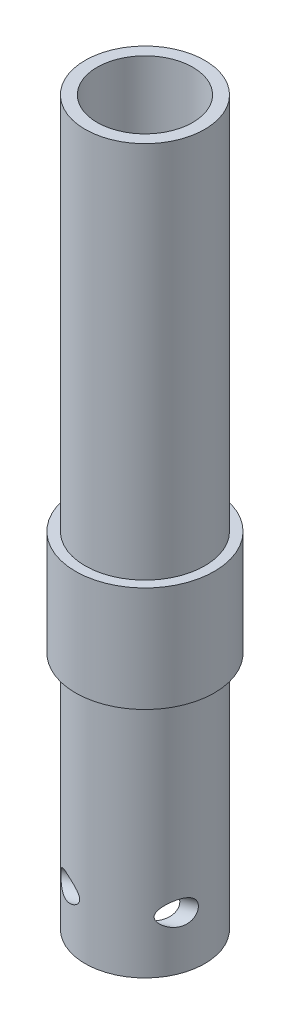
ISO-10303-21;
HEADER;
FILE_DESCRIPTION(('STEP AP214'),'2;1');
FILE_NAME('part.step','',(''),(''),'','','');
FILE_SCHEMA(('AUTOMOTIVE_DESIGN { 1 0 10303 214 1 1 1 1 }'));
ENDSEC;
DATA;
#1=APPLICATION_CONTEXT('core data for automotive mechanical design processes');
#2=APPLICATION_PROTOCOL_DEFINITION('international standard','automotive_design',2000,#1);
#3=PRODUCT_CONTEXT('',#1,'mechanical');
#4=PRODUCT('Part','Part','',(#3));
#5=PRODUCT_RELATED_PRODUCT_CATEGORY('part','',(#4));
#6=PRODUCT_DEFINITION_FORMATION('','',#4);
#7=PRODUCT_DEFINITION_CONTEXT('part definition',#1,'design');
#8=PRODUCT_DEFINITION('design','',#6,#7);
#9=PRODUCT_DEFINITION_SHAPE('','',#8);
#10=(LENGTH_UNIT() NAMED_UNIT(*) SI_UNIT(.MILLI.,.METRE.));
#11=(NAMED_UNIT(*) PLANE_ANGLE_UNIT() SI_UNIT($,.RADIAN.));
#12=(NAMED_UNIT(*) SI_UNIT($,.STERADIAN.) SOLID_ANGLE_UNIT());
#13=UNCERTAINTY_MEASURE_WITH_UNIT(LENGTH_MEASURE(1.E-05),#10,'distance_accuracy_value','');
#14=(GEOMETRIC_REPRESENTATION_CONTEXT(3) GLOBAL_UNCERTAINTY_ASSIGNED_CONTEXT((#13)) GLOBAL_UNIT_ASSIGNED_CONTEXT((#10,
#11,#12)) REPRESENTATION_CONTEXT('',''));
#15=CARTESIAN_POINT('',(0.,0.,0.));
#16=DIRECTION('',(0.,0.,1.));
#17=DIRECTION('',(1.,0.,0.));
#18=AXIS2_PLACEMENT_3D('',#15,#16,#17);
#19=CARTESIAN_POINT('',(0.,100.,0.));
#20=DIRECTION('',(0.,-1.,0.));
#21=DIRECTION('',(0.,0.,-1.));
#22=AXIS2_PLACEMENT_3D('',#19,#20,#21);
#23=CYLINDRICAL_SURFACE('',#22,12.5);
#24=CARTESIAN_POINT('',(-7.776099971489,45.,9.78684163729079));
#25=CARTESIAN_POINT('',(-7.77609778483126,45.1263367003507,9.78684471094488));
#26=CARTESIAN_POINT('',(-7.76752804540182,45.2527129329751,9.79367117736765));
#27=CARTESIAN_POINT('',(-7.73348745912618,45.5017566723523,9.82057156383112));
#28=CARTESIAN_POINT('',(-7.70800759392511,45.6244221636082,9.84065255262231));
#29=CARTESIAN_POINT('',(-7.64095105723785,45.8623118534212,9.89280807624151));
#30=CARTESIAN_POINT('',(-7.59940421681152,45.9775493833398,9.92486038054539));
#31=CARTESIAN_POINT('',(-7.50141378383988,46.1979201252928,9.99912756693056));
#32=CARTESIAN_POINT('',(-7.44497031270984,46.3030534196724,10.041342366182));
#33=CARTESIAN_POINT('',(-7.31674408794348,46.5042045491976,10.1351735030327));
#34=CARTESIAN_POINT('',(-7.24453182535561,46.5998278128818,10.1870454328291));
#35=CARTESIAN_POINT('',(-7.08790573048695,46.7765673728666,10.2966367002103));
#36=CARTESIAN_POINT('',(-7.0034887522786,46.8576799167386,10.3543575442794));
#37=CARTESIAN_POINT('',(-6.81510404323921,47.0125490646044,10.4794278272812));
#38=CARTESIAN_POINT('',(-6.71001370895046,47.0846326370942,10.5471512396708));
#39=CARTESIAN_POINT('',(-6.49019510251226,47.2105647081269,10.6838281870947));
#40=CARTESIAN_POINT('',(-6.37546017947159,47.2644004921285,10.7527825447454));
#41=CARTESIAN_POINT('',(-6.08637606215792,47.3747285651149,10.9199232980082));
#42=CARTESIAN_POINT('',(-5.90811068690859,47.4218578516402,11.017545209286));
#43=CARTESIAN_POINT('',(-5.54252950789474,47.4840110646395,11.2059297606435));
#44=CARTESIAN_POINT('',(-5.35519830625816,47.4989782580308,11.2966800077852));
#45=CARTESIAN_POINT('',(-5.04250259514496,47.5005813506547,11.438600782103));
#46=CARTESIAN_POINT('',(-4.91832843089079,47.495281746637,11.4925313012609));
#47=CARTESIAN_POINT('',(-4.66905514299733,47.4738190684344,11.5960389488433));
#48=CARTESIAN_POINT('',(-4.54395573478964,47.4576525018205,11.6456146719284));
#49=CARTESIAN_POINT('',(-4.29348840302836,47.4152547159133,11.7402695586507));
#50=CARTESIAN_POINT('',(-4.16812045260854,47.3890030199709,11.7853393373357));
#51=CARTESIAN_POINT('',(-3.91814072772144,47.3270910950891,11.8707884126639));
#52=CARTESIAN_POINT('',(-3.79352885737249,47.291432085767,11.9111683163522));
#53=CARTESIAN_POINT('',(-3.54341036382618,47.2103612713136,11.9879808111495));
#54=CARTESIAN_POINT('',(-3.41793235649242,47.1647756638201,12.0243229287864));
#55=CARTESIAN_POINT('',(-3.16931903756685,47.0644385485629,12.092229873619));
#56=CARTESIAN_POINT('',(-3.04618445762858,47.0096842288237,12.1237932295319));
#57=CARTESIAN_POINT('',(-2.80375658809936,46.8910806519565,12.1821358820797));
#58=CARTESIAN_POINT('',(-2.68445124860519,46.8272642604897,12.2089317107726));
#59=CARTESIAN_POINT('',(-2.45069474262067,46.6898797267467,12.2579903614303));
#60=CARTESIAN_POINT('',(-2.33623978339454,46.6163193966111,12.2802567789339));
#61=CARTESIAN_POINT('',(-2.12843005287223,46.4684237313358,12.3178514991161));
#62=CARTESIAN_POINT('',(-2.0342489467965,46.3953910364904,12.3337029553571));
#63=CARTESIAN_POINT('',(-1.85321320282143,46.2397101546404,12.3622003087538));
#64=CARTESIAN_POINT('',(-1.76637257199522,46.1570442697515,12.3748401657623));
#65=CARTESIAN_POINT('',(-1.60280561954686,45.9794472991353,12.3970923177274));
#66=CARTESIAN_POINT('',(-1.5262412827473,45.8843580460695,12.4066588435492));
#67=CARTESIAN_POINT('',(-1.39171033185998,45.6815944637039,12.4224683731489));
#68=CARTESIAN_POINT('',(-1.33364854276962,45.573988557738,12.4287284978488));
#69=CARTESIAN_POINT('',(-1.26438063053181,45.3952681727856,12.4359162812486));
#70=CARTESIAN_POINT('',(-1.24373983894188,45.3278798124946,12.4379793758663));
#71=CARTESIAN_POINT('',(-1.21389505768716,45.1905922472851,12.4409279695585));
#72=CARTESIAN_POINT('',(-1.20467731688646,45.1206961657279,12.4418148846153));
#73=CARTESIAN_POINT('',(-1.19872668606382,44.980134474972,12.4423899293371));
#74=CARTESIAN_POINT('',(-1.20203290619007,44.9094671434466,12.4420743036591));
#75=CARTESIAN_POINT('',(-1.22080566699826,44.7697748035186,12.4402457898281));
#76=CARTESIAN_POINT('',(-1.23628363619472,44.7007514014487,12.4387317764551));
#77=CARTESIAN_POINT('',(-1.28302037743132,44.5489711414792,12.4340069084293));
#78=CARTESIAN_POINT('',(-1.31728271913174,44.467162524843,12.4304634578037));
#79=CARTESIAN_POINT('',(-1.39826831832508,44.3100926437208,12.4216145755233));
#80=CARTESIAN_POINT('',(-1.44501952990453,44.2348465757813,12.4163051845129));
#81=CARTESIAN_POINT('',(-1.58006736815426,44.0450216495398,12.4000172433748));
#82=CARTESIAN_POINT('',(-1.67584717511204,43.9359549933466,12.3875824981354));
#83=CARTESIAN_POINT('',(-1.88146170230792,43.7327860507166,12.35803437011));
#84=CARTESIAN_POINT('',(-1.99133728940761,43.638729134213,12.3409072121662));
#85=CARTESIAN_POINT('',(-2.20723686998258,43.4730907920396,12.3040138501714));
#86=CARTESIAN_POINT('',(-2.31233598505724,43.4001735691256,12.2847511736937));
#87=CARTESIAN_POINT('',(-2.52750254624231,43.2632643504847,12.2422943680612));
#88=CARTESIAN_POINT('',(-2.63757351313665,43.1992788151016,12.219097419811));
#89=CARTESIAN_POINT('',(-2.86136153217914,43.0795677051564,12.1686395272227));
#90=CARTESIAN_POINT('',(-2.97508248251076,43.0238513450123,12.1413741161783));
#91=CARTESIAN_POINT('',(-3.20504951425737,42.9204892989775,12.0827041635367));
#92=CARTESIAN_POINT('',(-3.32129495786626,42.8728416007203,12.0513006574864));
#93=CARTESIAN_POINT('',(-3.56197248745999,42.7832127017265,11.9824396519709));
#94=CARTESIAN_POINT('',(-3.68650515755533,42.7416826000439,11.9447453047888));
#95=CARTESIAN_POINT('',(-3.93679817157988,42.6678454567598,11.8646067727875));
#96=CARTESIAN_POINT('',(-4.0625587079785,42.6355398859214,11.8221618320317));
#97=CARTESIAN_POINT('',(-4.31435317409858,42.5807264585529,11.7326115142855));
#98=CARTESIAN_POINT('',(-4.44038639594581,42.5582037581264,11.6855133320664));
#99=CARTESIAN_POINT('',(-4.6920952346984,42.5236282588308,11.586740088459));
#100=CARTESIAN_POINT('',(-4.81777082795195,42.5115761370997,11.5350647313002));
#101=CARTESIAN_POINT('',(-5.13778800811408,42.4953136443921,11.3972821522583));
#102=CARTESIAN_POINT('',(-5.33130407444943,42.4992346270142,11.3080551360534));
#103=CARTESIAN_POINT('',(-5.71085787813164,42.5390327405406,11.1211815819326));
#104=CARTESIAN_POINT('',(-5.89690427469158,42.5748716830064,11.0235452314787));
#105=CARTESIAN_POINT('',(-6.21960000741112,42.6720115964009,10.8440560463948));
#106=CARTESIAN_POINT('',(-6.35865021034996,42.7267287953602,10.7629859266446));
#107=CARTESIAN_POINT('',(-6.62450163098483,42.8611730072892,10.6014183118697));
#108=CARTESIAN_POINT('',(-6.75131645630706,42.9408718075902,10.5209202751321));
#109=CARTESIAN_POINT('',(-6.97023971097941,43.1117351403136,10.3769107056829));
#110=CARTESIAN_POINT('',(-7.06469034269178,43.1992861827513,10.3126832458939));
#111=CARTESIAN_POINT('',(-7.23893918287557,43.3921279007947,10.1911257270115));
#112=CARTESIAN_POINT('',(-7.31873903330125,43.4974165859537,10.1337948952422));
#113=CARTESIAN_POINT('',(-7.46138358901852,43.7243910629884,10.0292399930697));
#114=CARTESIAN_POINT('',(-7.52413349599876,43.8461631110204,9.98207272094039));
#115=CARTESIAN_POINT('',(-7.62975462007967,44.1022198715874,9.90158073751425));
#116=CARTESIAN_POINT('',(-7.67264734251533,44.2364908575211,9.86824105502995));
#117=CARTESIAN_POINT('',(-7.72843411029583,44.4760344912442,9.82457042199352));
#118=CARTESIAN_POINT('',(-7.74627477476798,44.5795090308142,9.81047674474926));
#119=CARTESIAN_POINT('',(-7.77010752498611,44.7886467633404,9.79161192830079));
#120=CARTESIAN_POINT('',(-7.77610180079786,44.894309548101,9.78683906594067));
#121=CARTESIAN_POINT('',(-7.776099971489,45.,9.78684163729079));
#122=B_SPLINE_CURVE_WITH_KNOTS('',3,(#24,#25,#26,#27,#28,#29,#30,#31,#32,#33,#34,#35,#36,#37,
#38,#39,#40,#41,#42,#43,#44,#45,#46,#47,#48,#49,#50,#51,#52,#53,#54,#55,#56,#57,#58,#59,#60,#61,
#62,#63,#64,#65,#66,#67,#68,#69,#70,#71,#72,#73,#74,#75,#76,#77,#78,#79,#80,#81,#82,#83,#84,#85,
#86,#87,#88,#89,#90,#91,#92,#93,#94,#95,#96,#97,#98,#99,#100,#101,#102,#103,#104,#105,#106,#107,
#108,#109,#110,#111,#112,#113,#114,#115,#116,#117,#118,#119,#120,#121),.UNSPECIFIED.,.T.,.F.,(4,
2,2,2,2,2,2,2,2,2,2,2,2,2,2,2,2,2,2,2,2,2,2,2,2,2,2,2,2,2,2,2,2,2,2,2,2,2,2,2,2,2,2,2,2,2,2,2,
4),(0.,0.378611784771891,0.757425649778078,1.13553953354858,1.51365033559022,1.90374638766344,
2.29394317204444,2.72521279259838,3.15678229482531,3.7792937001018,4.40290230068789,
4.80887518845114,5.21497861037193,5.62191097213871,6.02879060279984,6.44346747439869,
6.85827175800607,7.27160835956224,7.68461555455889,8.04479518496477,8.40564728345281,
8.77164788229967,9.13573423283271,9.34642705536553,9.55686599747781,9.7679626447134,
9.97925773555581,10.2440571781761,10.5094543663871,10.944072187441,11.3799798125721,
11.7675308137965,12.1553606963811,12.5436195479885,12.9317814227355,13.3411248953226,
13.7505335974062,14.1593189004075,14.5681306378061,15.2051180699423,15.8413443969102,
16.3494025045992,16.8568888978028,17.2868210105547,17.7167049101534,18.1489322200028,
18.5806903261781,18.8974870317294,19.2142251649543),.UNSPECIFIED.);
#123=CARTESIAN_POINT('',(-7.776099971489,45.,9.78684163729079));
#124=VERTEX_POINT('',#123);
#125=EDGE_CURVE('E87',#124,#124,#122,.T.);
#126=ORIENTED_EDGE('',*,*,#125,.T.);
#127=EDGE_LOOP('',(#126));
#128=FACE_BOUND('',#127,.T.);
#129=CARTESIAN_POINT('',(12.4351333592483,45.,1.27179335495583));
#130=CARTESIAN_POINT('',(12.4351340313042,44.8736632996493,1.27179706671584));
#131=CARTESIAN_POINT('',(12.4340328584509,44.7472870670249,1.2826979151258));
#132=CARTESIAN_POINT('',(12.4295045168785,44.4982433276476,1.32584749714552));
#133=CARTESIAN_POINT('',(12.4260761069961,44.3755778363918,1.35810762186901));
#134=CARTESIAN_POINT('',(12.4165578264944,44.1376881465788,1.44252432692656));
#135=CARTESIAN_POINT('',(12.4104728854913,44.0224506166602,1.49464403196783));
#136=CARTESIAN_POINT('',(12.3951695797011,43.8020798747072,1.61664218260722));
#137=CARTESIAN_POINT('',(12.3859512404527,43.6969465803276,1.68652048346341));
#138=CARTESIAN_POINT('',(12.3635274291012,43.4957954508023,1.84382089555759));
#139=CARTESIAN_POINT('',(12.3502048360645,43.4001721871182,1.93172889566931));
#140=CARTESIAN_POINT('',(12.3192209671665,43.2234326271333,2.12036075763363));
#141=CARTESIAN_POINT('',(12.3015585718399,43.1423200832614,2.22108792299237));
#142=CARTESIAN_POINT('',(12.2594673336961,42.9874509353956,2.4432583574825));
#143=CARTESIAN_POINT('',(12.2345219424403,42.9153673629058,2.56576617928059));
#144=CARTESIAN_POINT('',(12.1787791365254,42.789435291873,2.81853790887527));
#145=CARTESIAN_POINT('',(12.1479776647457,42.7355995078715,2.94880715060316));
#146=CARTESIAN_POINT('',(12.0656511693535,42.6252714348851,3.27242421820119));
#147=CARTESIAN_POINT('',(12.0109866768609,42.5781421483598,3.46818012445902));
#148=CARTESIAN_POINT('',(11.8904273580732,42.5159889353605,3.86137700681287));
#149=CARTESIAN_POINT('',(11.8245129077888,42.5010217419692,4.05882034477741));
#150=CARTESIAN_POINT('',(11.7076460632946,42.4994186493452,4.38171700717816));
#151=CARTESIAN_POINT('',(11.6595001738309,42.5047182533629,4.50824643969333));
#152=CARTESIAN_POINT('',(11.5594470456,42.5261809315655,4.7589262687512));
#153=CARTESIAN_POINT('',(11.507538602408,42.5423474981794,4.88307588727137));
#154=CARTESIAN_POINT('',(11.4003164554791,42.5847452840867,5.12842633676752));
#155=CARTESIAN_POINT('',(11.3449960171886,42.6109969800291,5.24962063139618));
#156=CARTESIAN_POINT('',(11.2315268777149,42.6729089049108,5.48819171454786));
#157=CARTESIAN_POINT('',(11.1733785439526,42.7085679142329,5.60556899571591));
#158=CARTESIAN_POINT('',(11.0536322128399,42.7896387286864,5.83820656008569));
#159=CARTESIAN_POINT('',(10.9919894622305,42.8352243361799,5.9533831685446));
#160=CARTESIAN_POINT('',(10.8669217939083,42.9355614514371,6.17872294276152));
#161=CARTESIAN_POINT('',(10.8034963344332,42.9903157711763,6.28888455723514));
#162=CARTESIAN_POINT('',(10.6759052022965,43.1089193480435,6.50311723455318));
#163=CARTESIAN_POINT('',(10.6117429427333,43.1727357395103,6.60720846816536));
#164=CARTESIAN_POINT('',(10.4835653796992,43.3101202732533,6.80875093919588));
#165=CARTESIAN_POINT('',(10.4195499998631,43.3836806033889,6.90620740221577));
#166=CARTESIAN_POINT('',(10.3012932817549,43.5315762686641,7.08117481548922));
#167=CARTESIAN_POINT('',(10.2468490964447,43.6046089635096,7.15964251644011));
#168=CARTESIAN_POINT('',(10.140784537981,43.7602898453596,7.30909601818934));
#169=CARTESIAN_POINT('',(10.089169626767,43.8429557302485,7.38006757649169));
#170=CARTESIAN_POINT('',(9.99083835103624,44.0205527008647,7.5126581734942));
#171=CARTESIAN_POINT('',(9.94420238410613,44.1156419539305,7.57412932668291));
#172=CARTESIAN_POINT('',(9.86154304086628,44.3184055362961,7.68144172553767));
#173=CARTESIAN_POINT('',(9.82546543453341,44.426011442262,7.72736303687482));
#174=CARTESIAN_POINT('',(9.78222395624338,44.6047318272144,7.78195133645705));
#175=CARTESIAN_POINT('',(9.76928229157999,44.6721201875054,7.79816281241086));
#176=CARTESIAN_POINT('',(9.7505451152998,44.8094077527148,7.82157911865136));
#177=CARTESIAN_POINT('',(9.74474101150982,44.8793038342721,7.82879477821803));
#178=CARTESIAN_POINT('',(9.74099587633006,45.0198655250279,7.83345467586764));
#179=CARTESIAN_POINT('',(9.74307947685396,45.0905328565533,7.83086830390122));
#180=CARTESIAN_POINT('',(9.75488414938085,45.2302251964813,7.81615743316817));
#181=CARTESIAN_POINT('',(9.76461239922731,45.2992485985512,7.80402397027148));
#182=CARTESIAN_POINT('',(9.79387785399244,45.4510288585208,7.76727916769115));
#183=CARTESIAN_POINT('',(9.8152751083767,45.5328374751569,7.74028617589796));
#184=CARTESIAN_POINT('',(9.8655129527785,45.6899073562792,7.67615249532232));
#185=CARTESIAN_POINT('',(9.89437023599305,45.7651534242187,7.63898903716081));
#186=CARTESIAN_POINT('',(9.97704828818712,45.9549783504602,7.53097257856381));
#187=CARTESIAN_POINT('',(10.0350541648554,46.0640450066534,7.4537475011473));
#188=CARTESIAN_POINT('',(10.1575355591807,46.2672139492834,7.28597165751085));
#189=CARTESIAN_POINT('',(10.2220297657611,46.3612708657869,7.19538202511679));
#190=CARTESIAN_POINT('',(10.3464392879044,46.5269092079604,7.01511550062648));
#191=CARTESIAN_POINT('',(10.4060688776024,46.5998264308743,6.92645216701557));
#192=CARTESIAN_POINT('',(10.5259852213535,46.7367356495152,6.7428240104107));
#193=CARTESIAN_POINT('',(10.5862724174239,46.8007211848984,6.64785469878243));
#194=CARTESIAN_POINT('',(10.706485512518,46.9204322948436,6.45246818911681));
#195=CARTESIAN_POINT('',(10.7664109381645,46.9761486549877,6.35204508149299));
#196=CARTESIAN_POINT('',(10.8850637184594,47.0795107010225,6.14650064162262));
#197=CARTESIAN_POINT('',(10.9437913686158,47.1271583992797,6.04138048913424));
#198=CARTESIAN_POINT('',(11.0626330157057,47.2167872982735,5.82105306403946));
#199=CARTESIAN_POINT('',(11.1226477865205,47.258317399956,5.70560837159062));
#200=CARTESIAN_POINT('',(11.2401359414194,47.3321545432401,5.47052261991847));
#201=CARTESIAN_POINT('',(11.2976089190058,47.3644601140786,5.35088089492929));
#202=CARTESIAN_POINT('',(11.4094108786869,47.419273541447,5.10814640131822));
#203=CARTESIAN_POINT('',(11.463744514831,47.4417962418735,4.98505916493326));
#204=CARTESIAN_POINT('',(11.5688868196823,47.4763717411691,4.73594355143328));
#205=CARTESIAN_POINT('',(11.6196952602177,47.4884238629003,4.60991498464196));
#206=CARTESIAN_POINT('',(11.7446375491677,47.5046863556078,4.28466975544053));
#207=CARTESIAN_POINT('',(11.815962258683,47.5007653729857,4.08386459075768));
#208=CARTESIAN_POINT('',(11.9473629849973,47.4609672594593,3.68172448551646));
#209=CARTESIAN_POINT('',(12.0074523404818,47.4251283169936,3.48039046464477));
#210=CARTESIAN_POINT('',(12.1044207802057,47.3279884035991,3.12409560757411));
#211=CARTESIAN_POINT('',(12.1435370205351,47.2732712046398,2.96796347444275));
#212=CARTESIAN_POINT('',(12.2136231105658,47.1388269927108,2.66486446094744));
#213=CARTESIAN_POINT('',(12.2446020778152,47.0591281924098,2.517887464692));
#214=CARTESIAN_POINT('',(12.2944723049253,46.8882648596864,2.26063446086645));
#215=CARTESIAN_POINT('',(12.3144873279856,46.8007138172487,2.14818230537927));
#216=CARTESIAN_POINT('',(12.3492180875946,46.6078720992053,1.93858110538454));
#217=CARTESIAN_POINT('',(12.3639344181604,46.5025834140463,1.84143034618013));
#218=CARTESIAN_POINT('',(12.3887558860172,46.2756089370116,1.66632154692228));
#219=CARTESIAN_POINT('',(12.3988354491658,46.1538368889796,1.58847101838921));
#220=CARTESIAN_POINT('',(12.4150145333704,45.8977801284126,1.45666427166397));
#221=CARTESIAN_POINT('',(12.4211183630769,45.7635091424789,1.40268220678117));
#222=CARTESIAN_POINT('',(12.4288362006879,45.5239655087558,1.3322569085439));
#223=CARTESIAN_POINT('',(12.4312129455457,45.4204909691858,1.30964558105182));
#224=CARTESIAN_POINT('',(12.434361095348,45.2113532366595,1.27941363709486));
#225=CARTESIAN_POINT('',(12.4351327970214,45.105690451899,1.27179024978059));
#226=CARTESIAN_POINT('',(12.4351333592483,45.,1.27179335495583));
#227=B_SPLINE_CURVE_WITH_KNOTS('',3,(#129,#130,#131,#132,#133,#134,#135,#136,#137,#138,#139,
#140,#141,#142,#143,#144,#145,#146,#147,#148,#149,#150,#151,#152,#153,#154,#155,#156,#157,#158,
#159,#160,#161,#162,#163,#164,#165,#166,#167,#168,#169,#170,#171,#172,#173,#174,#175,#176,#177,
#178,#179,#180,#181,#182,#183,#184,#185,#186,#187,#188,#189,#190,#191,#192,#193,#194,#195,#196,
#197,#198,#199,#200,#201,#202,#203,#204,#205,#206,#207,#208,#209,#210,#211,#212,#213,#214,#215,
#216,#217,#218,#219,#220,#221,#222,#223,#224,#225,#226),.UNSPECIFIED.,.T.,.F.,(4,2,2,2,2,2,2,2,
2,2,2,2,2,2,2,2,2,2,2,2,2,2,2,2,2,2,2,2,2,2,2,2,2,2,2,2,2,2,2,2,2,2,2,2,2,2,2,2,4),(0.,
0.378611784771898,0.757425649778079,1.13553953354858,1.51365033559022,1.90374638766343,
2.29394317204443,2.72521279259838,3.15678229482531,3.7792937001018,4.40290230068789,
4.80887518845114,5.21497861037193,5.62191097213872,6.02879060279985,6.4434674743987,
6.85827175800608,7.27160835956225,7.6846155545589,8.04479518496477,8.40564728345281,
8.77164788229967,9.1357342328327,9.34642705536552,9.55686599747779,9.76796264471338,
9.97925773555579,10.2440571781761,10.5094543663871,10.944072187441,11.3799798125721,
11.7675308137965,12.155360696381,12.5436195479885,12.9317814227355,13.3411248953225,
13.7505335974061,14.1593189004074,14.568130637806,15.2051180699422,15.8413443969101,
16.3494025045991,16.8568888978028,17.2868210105546,17.7167049101533,18.1489322200028,
18.5806903261781,18.8974870317294,19.2142251649543),.UNSPECIFIED.);
#228=CARTESIAN_POINT('',(12.4351333592483,45.,1.27179335495583));
#229=VERTEX_POINT('',#228);
#230=EDGE_CURVE('E93',#229,#229,#227,.T.);
#231=ORIENTED_EDGE('',*,*,#230,.T.);
#232=EDGE_LOOP('',(#231));
#233=FACE_BOUND('',#232,.T.);
#234=CARTESIAN_POINT('',(0.,84.,0.));
#235=DIRECTION('',(0.,-1.,0.));
#236=DIRECTION('',(0.,0.,-1.));
#237=AXIS2_PLACEMENT_3D('',#234,#235,#236);
#238=CIRCLE('',#237,12.5);
#239=CARTESIAN_POINT('',(0.,84.,-12.5));
#240=VERTEX_POINT('',#239);
#241=EDGE_CURVE('E64',#240,#240,#238,.T.);
#242=ORIENTED_EDGE('',*,*,#241,.T.);
#243=EDGE_LOOP('',(#242));
#244=FACE_BOUND('',#243,.T.);
#245=CARTESIAN_POINT('',(0.,34.,0.));
#246=DIRECTION('',(0.,-1.,0.));
#247=DIRECTION('',(0.,0.,-1.));
#248=AXIS2_PLACEMENT_3D('',#245,#246,#247);
#249=CIRCLE('',#248,12.5);
#250=CARTESIAN_POINT('',(0.,34.,-12.5));
#251=VERTEX_POINT('',#250);
#252=EDGE_CURVE('E84',#251,#251,#249,.T.);
#253=ORIENTED_EDGE('',*,*,#252,.F.);
#254=EDGE_LOOP('',(#253));
#255=FACE_BOUND('',#254,.T.);
#256=ADVANCED_FACE('F45',(#128,#233,#244,#255),#23,.T.);
#257=CARTESIAN_POINT('',(0.,84.,0.));
#258=DIRECTION('',(0.,-1.,0.));
#259=DIRECTION('',(0.,0.,-1.));
#260=AXIS2_PLACEMENT_3D('',#257,#258,#259);
#261=PLANE('',#260);
#262=CARTESIAN_POINT('',(0.,84.,0.));
#263=DIRECTION('',(0.,-1.,0.));
#264=DIRECTION('',(0.,0.,-1.));
#265=AXIS2_PLACEMENT_3D('',#262,#263,#264);
#266=CIRCLE('',#265,14.5);
#267=CARTESIAN_POINT('',(0.,84.,-14.5));
#268=VERTEX_POINT('',#267);
#269=EDGE_CURVE('E70',#268,#268,#266,.T.);
#270=ORIENTED_EDGE('',*,*,#269,.T.);
#271=EDGE_LOOP('',(#270));
#272=FACE_BOUND('',#271,.T.);
#273=ORIENTED_EDGE('',*,*,#241,.F.);
#274=EDGE_LOOP('',(#273));
#275=FACE_BOUND('',#274,.T.);
#276=ADVANCED_FACE('F115',(#272,#275),#261,.T.);
#277=CARTESIAN_POINT('',(0.,84.,0.));
#278=DIRECTION('',(0.,1.,0.));
#279=DIRECTION('',(0.,0.,1.));
#280=AXIS2_PLACEMENT_3D('',#277,#278,#279);
#281=CYLINDRICAL_SURFACE('',#280,14.5);
#282=ORIENTED_EDGE('',*,*,#269,.F.);
#283=EDGE_LOOP('',(#282));
#284=FACE_BOUND('',#283,.T.);
#285=CARTESIAN_POINT('',(0.,106.,0.));
#286=DIRECTION('',(0.,1.,0.));
#287=DIRECTION('',(0.,0.,1.));
#288=AXIS2_PLACEMENT_3D('',#285,#286,#287);
#289=CIRCLE('',#288,14.5);
#290=CARTESIAN_POINT('',(0.,106.,14.5));
#291=VERTEX_POINT('',#290);
#292=EDGE_CURVE('E77',#291,#291,#289,.T.);
#293=ORIENTED_EDGE('',*,*,#292,.F.);
#294=EDGE_LOOP('',(#293));
#295=FACE_BOUND('',#294,.T.);
#296=ADVANCED_FACE('F113',(#284,#295),#281,.T.);
#297=CARTESIAN_POINT('',(0.,106.,0.));
#298=DIRECTION('',(0.,1.,0.));
#299=DIRECTION('',(0.,0.,1.));
#300=AXIS2_PLACEMENT_3D('',#297,#298,#299);
#301=PLANE('',#300);
#302=CARTESIAN_POINT('',(0.,106.,0.));
#303=DIRECTION('',(0.,1.,0.));
#304=DIRECTION('',(0.,0.,1.));
#305=AXIS2_PLACEMENT_3D('',#302,#303,#304);
#306=CIRCLE('',#305,12.5);
#307=CARTESIAN_POINT('',(0.,106.,12.5));
#308=VERTEX_POINT('',#307);
#309=EDGE_CURVE('E74',#308,#308,#306,.T.);
#310=ORIENTED_EDGE('',*,*,#309,.F.);
#311=EDGE_LOOP('',(#310));
#312=FACE_BOUND('',#311,.T.);
#313=ORIENTED_EDGE('',*,*,#292,.T.);
#314=EDGE_LOOP('',(#313));
#315=FACE_BOUND('',#314,.T.);
#316=ADVANCED_FACE('F109',(#312,#315),#301,.T.);
#317=ORIENTED_EDGE('',*,*,#309,.T.);
#318=EDGE_LOOP('',(#317));
#319=FACE_BOUND('',#318,.T.);
#320=CARTESIAN_POINT('',(0.,185.,0.));
#321=DIRECTION('',(0.,1.,0.));
#322=DIRECTION('',(0.,0.,1.));
#323=AXIS2_PLACEMENT_3D('',#320,#321,#322);
#324=CIRCLE('',#323,12.5);
#325=CARTESIAN_POINT('',(0.,185.,12.5));
#326=VERTEX_POINT('',#325);
#327=EDGE_CURVE('E10',#326,#326,#324,.T.);
#328=ORIENTED_EDGE('',*,*,#327,.F.);
#329=EDGE_LOOP('',(#328));
#330=FACE_BOUND('',#329,.T.);
#331=ADVANCED_FACE('F112',(#319,#330),#23,.T.);
#332=CARTESIAN_POINT('',(0.,185.,0.));
#333=DIRECTION('',(0.,1.,0.));
#334=DIRECTION('',(0.,0.,1.));
#335=AXIS2_PLACEMENT_3D('',#332,#333,#334);
#336=PLANE('',#335);
#337=ORIENTED_EDGE('',*,*,#327,.T.);
#338=EDGE_LOOP('',(#337));
#339=FACE_BOUND('',#338,.T.);
#340=CARTESIAN_POINT('',(0.,185.,0.));
#341=DIRECTION('',(0.,1.,0.));
#342=DIRECTION('',(0.,0.,1.));
#343=AXIS2_PLACEMENT_3D('',#340,#341,#342);
#344=CIRCLE('',#343,10.);
#345=CARTESIAN_POINT('',(0.,185.,10.));
#346=VERTEX_POINT('',#345);
#347=EDGE_CURVE('E58',#346,#346,#344,.T.);
#348=ORIENTED_EDGE('',*,*,#347,.F.);
#349=EDGE_LOOP('',(#348));
#350=FACE_BOUND('',#349,.T.);
#351=ADVANCED_FACE('F122',(#339,#350),#336,.T.);
#352=CARTESIAN_POINT('',(0.,100.,0.));
#353=DIRECTION('',(0.,-1.,0.));
#354=DIRECTION('',(0.,0.,-1.));
#355=AXIS2_PLACEMENT_3D('',#352,#353,#354);
#356=CYLINDRICAL_SURFACE('',#355,10.);
#357=CARTESIAN_POINT('',(-5.04290663428486,45.,8.63533975462956));
#358=CARTESIAN_POINT('',(-5.04289998045065,45.1175829285567,8.63534590716366));
#359=CARTESIAN_POINT('',(-5.03391354437731,45.2352418901898,8.64061102195753));
#360=CARTESIAN_POINT('',(-4.99829411244754,45.4669929796158,8.6612619833468));
#361=CARTESIAN_POINT('',(-4.97164472261973,45.5810816905421,8.676657232188));
#362=CARTESIAN_POINT('',(-4.90183304114463,45.8020470835805,8.71628492717272));
#363=CARTESIAN_POINT('',(-4.85872008315742,45.9089442007151,8.74049096143912));
#364=CARTESIAN_POINT('',(-4.7575606996845,46.1133535975528,8.79596090090485));
#365=CARTESIAN_POINT('',(-4.69951461701557,46.2108660926263,8.82722464407975));
#366=CARTESIAN_POINT('',(-4.5676065932373,46.398866005067,8.89621949819473));
#367=CARTESIAN_POINT('',(-4.49316680762893,46.4888637565604,8.93417267371981));
#368=CARTESIAN_POINT('',(-4.3324994952278,46.6559829215198,9.01318407702921));
#369=CARTESIAN_POINT('',(-4.24626649302382,46.7330983167398,9.05424374313026));
#370=CARTESIAN_POINT('',(-4.02233829121489,46.9069841220215,9.15652799977132));
#371=CARTESIAN_POINT('',(-3.87922955996304,46.996455830386,9.21833253988671));
#372=CARTESIAN_POINT('',(-3.57884605054981,47.1500617529804,9.33906783314264));
#373=CARTESIAN_POINT('',(-3.42154143417523,47.2141409968957,9.39799211204812));
#374=CARTESIAN_POINT('',(-3.14196345896502,47.3058498459561,9.49440113050756));
#375=CARTESIAN_POINT('',(-3.02182401400723,47.3386536656077,9.53335284210099));
#376=CARTESIAN_POINT('',(-2.77797655007304,47.3941190009743,9.60724049789843));
#377=CARTESIAN_POINT('',(-2.65426688595113,47.4167757588847,9.64217455258997));
#378=CARTESIAN_POINT('',(-2.40429018965509,47.4533442944675,9.70752829655212));
#379=CARTESIAN_POINT('',(-2.27802074334099,47.4672473787435,9.73794347523874));
#380=CARTESIAN_POINT('',(-2.02380264477841,47.4875869868538,9.79393599266493));
#381=CARTESIAN_POINT('',(-1.89585341125024,47.494020853252,9.81951160685261));
#382=CARTESIAN_POINT('',(-1.55414575300754,47.5027951333294,9.88086608334593));
#383=CARTESIAN_POINT('',(-1.33944659163898,47.4996375442314,9.91225008026779));
#384=CARTESIAN_POINT('',(-0.908983342288901,47.4808535817819,9.96096211470783));
#385=CARTESIAN_POINT('',(-0.693218622441956,47.4652186180751,9.97828045179633));
#386=CARTESIAN_POINT('',(-0.261189528926295,47.4255299438065,9.99893420583684));
#387=CARTESIAN_POINT('',(-0.0449255602031824,47.4014515207472,10.002228200035));
#388=CARTESIAN_POINT('',(0.386720083834884,47.348607697176,9.99485099920079));
#389=CARTESIAN_POINT('',(0.602101896812961,47.3198430589405,9.98418207344472));
#390=CARTESIAN_POINT('',(1.05115551530272,47.2584172114751,9.9473789912393));
#391=CARTESIAN_POINT('',(1.28470360014859,47.2256399051625,9.91992292328782));
#392=CARTESIAN_POINT('',(1.74966517329475,47.1629990824091,9.84855213546823));
#393=CARTESIAN_POINT('',(1.98107882230185,47.1331353449501,9.80463866525524));
#394=CARTESIAN_POINT('',(2.44002690991376,47.0805646004893,9.70058692196884));
#395=CARTESIAN_POINT('',(2.66757377640548,47.0578272761633,9.64051945747408));
#396=CARTESIAN_POINT('',(3.11861814617599,47.022802745589,9.50419216362173));
#397=CARTESIAN_POINT('',(3.34211639245185,47.010513602495,9.42793533866576));
#398=CARTESIAN_POINT('',(3.68559362684675,47.0010553240009,9.29697324070291));
#399=CARTESIAN_POINT('',(3.80755836011118,46.9995992211654,9.24769178780081));
#400=CARTESIAN_POINT('',(4.04944367024634,47.0005878123323,9.144358644242));
#401=CARTESIAN_POINT('',(4.16936422667114,47.0030325453278,9.09030690590608));
#402=CARTESIAN_POINT('',(4.40688836065925,47.0117030660426,8.97756213168128));
#403=CARTESIAN_POINT('',(4.52449150746416,47.0179295499922,8.9188682428911));
#404=CARTESIAN_POINT('',(4.75711749235961,47.0338325415451,8.79699285320497));
#405=CARTESIAN_POINT('',(4.87213999730614,47.043509491888,8.73381077724972));
#406=CARTESIAN_POINT('',(5.21427274050849,47.0771478131734,8.53702613822401));
#407=CARTESIAN_POINT('',(5.43716638192466,47.1056610175999,8.3967940940589));
#408=CARTESIAN_POINT('',(5.87047876005095,47.1696080486799,8.09978619839378));
#409=CARTESIAN_POINT('',(6.08089730051474,47.205041984166,7.94301008674613));
#410=CARTESIAN_POINT('',(6.47770622449502,47.2749688994642,7.62238992503607));
#411=CARTESIAN_POINT('',(6.66478027549079,47.3094099485845,7.45937984831688));
#412=CARTESIAN_POINT('',(7.02675984883927,47.3739930999256,7.11943111217808));
#413=CARTESIAN_POINT('',(7.20166202571648,47.4041340226156,6.94248865166202));
#414=CARTESIAN_POINT('',(7.53745660742857,47.4544349628299,6.57632728052274));
#415=CARTESIAN_POINT('',(7.6984262818029,47.4746533830691,6.38718780364515));
#416=CARTESIAN_POINT('',(8.00618583477754,47.499275376595,5.99688093760011));
#417=CARTESIAN_POINT('',(8.15299233823682,47.5036977167498,5.79572811036196));
#418=CARTESIAN_POINT('',(8.41237911595024,47.4905282862009,5.41094639713208));
#419=CARTESIAN_POINT('',(8.52691362183153,47.4757904432775,5.22855241505081));
#420=CARTESIAN_POINT('',(8.74295592934293,47.4233856263264,4.85864765308057));
#421=CARTESIAN_POINT('',(8.84444537083098,47.3856867548609,4.6711301022866));
#422=CARTESIAN_POINT('',(8.98594429804524,47.3068412144336,4.38909568734099));
#423=CARTESIAN_POINT('',(9.03159100095418,47.2765627640323,4.29431851910433));
#424=CARTESIAN_POINT('',(9.11879989414809,47.2076082484255,4.10587852297995));
#425=CARTESIAN_POINT('',(9.16036143987119,47.1689308611036,4.01221587298508));
#426=CARTESIAN_POINT('',(9.23903220944773,47.082500454833,3.82757452040922));
#427=CARTESIAN_POINT('',(9.27615395331254,47.0347739873367,3.73658884353698));
#428=CARTESIAN_POINT('',(9.34585196623002,46.9295550070556,3.55867643816258));
#429=CARTESIAN_POINT('',(9.37843137431112,46.8720693000304,3.47174693451744));
#430=CARTESIAN_POINT('',(9.4465109756637,46.7311323780411,3.28266141499868));
#431=CARTESIAN_POINT('',(9.48069691732299,46.6447843727396,3.18214926591603));
#432=CARTESIAN_POINT('',(9.54157918116853,46.4561268066163,2.99466318188146));
#433=CARTESIAN_POINT('',(9.56827799900665,46.3538225821514,2.90768474010863));
#434=CARTESIAN_POINT('',(9.61443052283997,46.1338170890352,2.7512634406025));
#435=CARTESIAN_POINT('',(9.63382932831668,46.0160078031155,2.6819546771753));
#436=CARTESIAN_POINT('',(9.66532010718009,45.7687216292668,2.56617175055209));
#437=CARTESIAN_POINT('',(9.67741663263736,45.6392520680542,2.51968336505044));
#438=CARTESIAN_POINT('',(9.69358086844363,45.3890236846906,2.45670822441805));
#439=CARTESIAN_POINT('',(9.69842723651899,45.2690384195317,2.43732972299006));
#440=CARTESIAN_POINT('',(9.70278422944883,45.0274494524419,2.41993222599737));
#441=CARTESIAN_POINT('',(9.70229718785793,44.9058464815736,2.42190388897941));
#442=CARTESIAN_POINT('',(9.69619073019867,44.6730931920361,2.44622409191076));
#443=CARTESIAN_POINT('',(9.6909161584129,44.5617870666607,2.46720334002496));
#444=CARTESIAN_POINT('',(9.67560721772308,44.344294901035,2.5265700197191));
#445=CARTESIAN_POINT('',(9.66557320260738,44.2381084808629,2.56495615736644));
#446=CARTESIAN_POINT('',(9.64034678521048,44.0314218286572,2.65820893936789));
#447=CARTESIAN_POINT('',(9.62505795761933,43.9310721383407,2.7133812640427));
#448=CARTESIAN_POINT('',(9.58922450402567,43.7403038476353,2.8374159314754));
#449=CARTESIAN_POINT('',(9.56867842002666,43.6498880121642,2.90628207076025));
#450=CARTESIAN_POINT('',(9.52001598071319,43.4719636298243,3.06211796809935));
#451=CARTESIAN_POINT('',(9.49136067648732,43.3855761890783,3.1501930900412));
#452=CARTESIAN_POINT('',(9.42767856304932,43.2265974814636,3.33594245030329));
#453=CARTESIAN_POINT('',(9.3926482703485,43.1540138019566,3.43362192325327));
#454=CARTESIAN_POINT('',(9.3256767096281,43.0382820127964,3.61087822134718));
#455=CARTESIAN_POINT('',(9.29504291008329,42.9922627264116,3.68910802424692));
#456=CARTESIAN_POINT('',(9.23036175629626,42.9075376357248,3.84809185140775));
#457=CARTESIAN_POINT('',(9.19631301397215,42.8688348239625,3.92884689285618));
#458=CARTESIAN_POINT('',(9.0891295189665,42.7628826375439,4.17364493752291));
#459=CARTESIAN_POINT('',(9.01102661479304,42.7059058077099,4.34003456810834));
#460=CARTESIAN_POINT('',(8.86425404129488,42.6264276451237,4.63083124094814));
#461=CARTESIAN_POINT('',(8.79815823289692,42.5988584452936,4.75526381102267));
#462=CARTESIAN_POINT('',(8.65983343173311,42.5546337190294,5.00273429326002));
#463=CARTESIAN_POINT('',(8.58760129435561,42.5379838268572,5.1257714532795));
#464=CARTESIAN_POINT('',(8.43744016068489,42.5138593765569,5.36936854209624));
#465=CARTESIAN_POINT('',(8.35950517765608,42.5063946115506,5.48992569234502));
#466=CARTESIAN_POINT('',(8.19839079199707,42.499068817529,5.72774256215398));
#467=CARTESIAN_POINT('',(8.11520957638142,42.4992104316558,5.84500112132453));
#468=CARTESIAN_POINT('',(7.88544902778526,42.5078598198155,6.15452065752066));
#469=CARTESIAN_POINT('',(7.73437558547676,42.5220162187925,6.3433022130801));
#470=CARTESIAN_POINT('',(7.4196071068058,42.5618170135333,6.70877841387892));
#471=CARTESIAN_POINT('',(7.25590338999149,42.5874693694457,6.88546458601916));
#472=CARTESIAN_POINT('',(6.91634827316854,42.6451459040603,7.226490740839));
#473=CARTESIAN_POINT('',(6.74046714820232,42.677186060877,7.39079831088698));
#474=CARTESIAN_POINT('',(6.37751892210626,42.7427517966422,7.70616964491742));
#475=CARTESIAN_POINT('',(6.19045291743251,42.7762772299055,7.85723470349728));
#476=CARTESIAN_POINT('',(5.79000674325839,42.8427493316578,8.15741373133101));
#477=CARTESIAN_POINT('',(5.57572169873896,42.8754303254109,8.30538364905486));
#478=CARTESIAN_POINT('',(5.13531680422394,42.9315198067384,8.58466236060315));
#479=CARTESIAN_POINT('',(4.90919850686702,42.9549295073609,8.71597333254099));
#480=CARTESIAN_POINT('',(4.56271300527962,42.9797840047392,8.89936332391229));
#481=CARTESIAN_POINT('',(4.44621002586669,42.9863562425251,8.95813952968628));
#482=CARTESIAN_POINT('',(4.21087548271349,42.9958086302181,9.07113861723956));
#483=CARTESIAN_POINT('',(4.09204420175179,42.9986892256977,9.12536204778954));
#484=CARTESIAN_POINT('',(3.85232723101419,43.0005981079606,9.2291186732304));
#485=CARTESIAN_POINT('',(3.7314416391472,42.9996265778272,9.27865209091301));
#486=CARTESIAN_POINT('',(3.4879092193307,42.9938927089448,9.37291548884472));
#487=CARTESIAN_POINT('',(3.36526238215172,42.9891303503234,9.41764544391176));
#488=CARTESIAN_POINT('',(3.01251116001702,42.970411429783,9.53852803086664));
#489=CARTESIAN_POINT('',(2.78055123202009,42.952071575918,9.60868860051447));
#490=CARTESIAN_POINT('',(2.31305538303104,42.906078347346,9.73181738244305));
#491=CARTESIAN_POINT('',(2.07751871273952,42.8784229946776,9.78478193879708));
#492=CARTESIAN_POINT('',(1.60301944472242,42.8178965539815,9.87364220206899));
#493=CARTESIAN_POINT('',(1.36404738199219,42.785006505885,9.90947388820518));
#494=CARTESIAN_POINT('',(0.884212598197992,42.7187202545304,9.96375753150995));
#495=CARTESIAN_POINT('',(0.643349957081079,42.6853240726203,9.98221021963588));
#496=CARTESIAN_POINT('',(0.205228531446483,42.6286489209946,9.99983004597306));
#497=CARTESIAN_POINT('',(0.00818067104356928,42.6046429417669,10.0019427579413));
#498=CARTESIAN_POINT('',(-0.386351993715307,42.562221413146,9.99448158369112));
#499=CARTESIAN_POINT('',(-0.583836850694741,42.5438065786074,9.98490620387929));
#500=CARTESIAN_POINT('',(-0.977903127601689,42.5155947467112,9.95402478173198));
#501=CARTESIAN_POINT('',(-1.17448538295397,42.5057696112987,9.9327574156768));
#502=CARTESIAN_POINT('',(-1.56617798051195,42.4979612365641,9.87857177513741));
#503=CARTESIAN_POINT('',(-1.76128918889063,42.4999703771676,9.84566101065265));
#504=CARTESIAN_POINT('',(-2.1774744780969,42.5211251303307,9.76267783024832));
#505=CARTESIAN_POINT('',(-2.39809993368719,42.5427719631718,9.7107823260063));
#506=CARTESIAN_POINT('',(-2.72286489277916,42.5958297261638,9.62281949451426));
#507=CARTESIAN_POINT('',(-2.83009585577376,42.6169483616208,9.59181027596195));
#508=CARTESIAN_POINT('',(-3.04177808006715,42.6669942026827,9.52679575284224));
#509=CARTESIAN_POINT('',(-3.14622999018191,42.6959195677876,9.49279115573095));
#510=CARTESIAN_POINT('',(-3.40918139266749,42.7812744652178,9.4024522423772));
#511=CARTESIAN_POINT('',(-3.56509738084986,42.8440279813877,9.34430068139784));
#512=CARTESIAN_POINT('',(-3.86323760102339,42.9943578623121,9.22502455242407));
#513=CARTESIAN_POINT('',(-4.0054835030631,43.0818940418025,9.16390492900696));
#514=CARTESIAN_POINT('',(-4.24133094647466,43.2617474150891,9.05671579125112));
#515=CARTESIAN_POINT('',(-4.3387613077283,43.3488128138093,9.01028340981611));
#516=CARTESIAN_POINT('',(-4.51845847068596,43.5394835986622,8.92152234980173));
#517=CARTESIAN_POINT('',(-4.60072622854496,43.6430879410784,8.87919341253869));
#518=CARTESIAN_POINT('',(-4.71038504438515,43.8100490292305,8.82122569195601));
#519=CARTESIAN_POINT('',(-4.74477678141337,43.8679294791437,8.80275015434081));
#520=CARTESIAN_POINT('',(-4.80841524313059,43.9871061630119,8.7681497130351));
#521=CARTESIAN_POINT('',(-4.83766465141589,44.0484005932087,8.75202358403012));
#522=CARTESIAN_POINT('',(-4.89062374347794,44.1738831686606,8.72254092837356));
#523=CARTESIAN_POINT('',(-4.91434048710964,44.2380675000841,8.70918087459983));
#524=CARTESIAN_POINT('',(-4.95596869855449,44.3688120394149,8.68555961162763));
#525=CARTESIAN_POINT('',(-4.97388267719219,44.4353712058668,8.67529706228748));
#526=CARTESIAN_POINT('',(-5.00669966459652,44.5839623976236,8.65640773853069));
#527=CARTESIAN_POINT('',(-5.02025514554141,44.6663947270931,8.64853485467942));
#528=CARTESIAN_POINT('',(-5.03836050107135,44.8325386085647,8.63799896026956));
#529=CARTESIAN_POINT('',(-5.0429113735655,44.9162500177802,8.6353353724065));
#530=CARTESIAN_POINT('',(-5.04290663428486,45.,8.63533975462956));
#531=B_SPLINE_CURVE_WITH_KNOTS('',3,(#357,#358,#359,#360,#361,#362,#363,#364,#365,#366,#367,
#368,#369,#370,#371,#372,#373,#374,#375,#376,#377,#378,#379,#380,#381,#382,#383,#384,#385,#386,
#387,#388,#389,#390,#391,#392,#393,#394,#395,#396,#397,#398,#399,#400,#401,#402,#403,#404,#405,
#406,#407,#408,#409,#410,#411,#412,#413,#414,#415,#416,#417,#418,#419,#420,#421,#422,#423,#424,
#425,#426,#427,#428,#429,#430,#431,#432,#433,#434,#435,#436,#437,#438,#439,#440,#441,#442,#443,
#444,#445,#446,#447,#448,#449,#450,#451,#452,#453,#454,#455,#456,#457,#458,#459,#460,#461,#462,
#463,#464,#465,#466,#467,#468,#469,#470,#471,#472,#473,#474,#475,#476,#477,#478,#479,#480,#481,
#482,#483,#484,#485,#486,#487,#488,#489,#490,#491,#492,#493,#494,#495,#496,#497,#498,#499,#500,
#501,#502,#503,#504,#505,#506,#507,#508,#509,#510,#511,#512,#513,#514,#515,#516,#517,#518,#519,
#520,#521,#522,#523,#524,#525,#526,#527,#528,#529,#530),.UNSPECIFIED.,.T.,.F.,(4,2,2,2,2,2,2,2,
2,2,2,2,2,2,2,2,2,2,2,2,2,2,2,2,2,2,2,2,2,2,2,2,2,2,2,2,2,2,2,2,2,2,2,2,2,2,2,2,2,2,2,2,2,2,2,2,
2,2,2,2,2,2,2,2,2,2,2,2,2,2,2,2,2,2,2,2,2,2,2,2,2,2,2,2,2,2,4),(0.,0.352429728683113,
0.70518702596765,1.05689546458817,1.40859582982849,1.77558511237156,2.14274536459588,
2.67895950976197,3.21632820636333,3.60727367804745,3.99840226676441,4.38991868063691,
4.78157434755285,5.43152765063842,6.08192881649626,6.7342497013752,7.38646458317557,
8.0981721054725,8.80982559683546,9.51840912119263,10.2268612622581,10.6213793280385,
11.0159013374893,11.4104960015233,11.805141315415,12.598675993207,13.3922231508167,
14.143079486725,14.8941413892369,15.6407279640069,16.3864272451693,17.0327954297407,
17.6800636029435,18.0081364516803,18.3362609813997,18.6634372368879,18.9903862611057,
19.3992736320299,19.808024547785,20.2197908391286,20.6313001792148,20.9942761037786,
21.3570932199361,21.695686133649,22.0342538823481,22.37939900398,22.7246399487534,
23.1031725201532,23.4819125578074,23.7689020087316,24.0560085895499,24.630903848128,
25.0610948644033,25.4915076809901,25.9223790043488,26.3534000522346,27.0788400750214,
27.8047831924501,28.5325654581945,29.2602764958931,30.0467908397466,30.8332022427025,
31.2250391111836,31.6168286814359,32.0085996309898,32.4003726342964,33.128495349492,
33.8567727646614,34.5877506852172,35.318697859608,35.9138741182962,36.5091264411037,
37.1024214560159,37.6953344908457,38.3763223653559,38.7168480034493,39.0572934298757,
39.5888956712609,40.119640804895,40.5340736346412,40.9484803212718,41.1576679399301,
41.3667460649422,41.5755559222306,41.7842753075748,42.0353258252028,42.2863485193407),.UNSPECIFIED.);
#532=CARTESIAN_POINT('',(-5.04290663428486,45.,8.63533975462956));
#533=VERTEX_POINT('',#532);
#534=EDGE_CURVE('E49',#533,#533,#531,.T.);
#535=ORIENTED_EDGE('',*,*,#534,.F.);
#536=EDGE_LOOP('',(#535));
#537=FACE_BOUND('',#536,.T.);
#538=ORIENTED_EDGE('',*,*,#347,.T.);
#539=EDGE_LOOP('',(#538));
#540=FACE_BOUND('',#539,.T.);
#541=CARTESIAN_POINT('',(0.,34.,0.));
#542=DIRECTION('',(0.,-1.,0.));
#543=DIRECTION('',(0.,0.,-1.));
#544=AXIS2_PLACEMENT_3D('',#541,#542,#543);
#545=CIRCLE('',#544,10.);
#546=CARTESIAN_POINT('',(0.,34.,-10.));
#547=VERTEX_POINT('',#546);
#548=EDGE_CURVE('E81',#547,#547,#545,.F.);
#549=ORIENTED_EDGE('',*,*,#548,.F.);
#550=EDGE_LOOP('',(#549));
#551=FACE_BOUND('',#550,.T.);
#552=ADVANCED_FACE('F107',(#537,#540,#551),#356,.F.);
#553=CARTESIAN_POINT('',(0.,34.,0.));
#554=DIRECTION('',(0.,-1.,0.));
#555=DIRECTION('',(0.,0.,-1.));
#556=AXIS2_PLACEMENT_3D('',#553,#554,#555);
#557=PLANE('',#556);
#558=ORIENTED_EDGE('',*,*,#252,.T.);
#559=EDGE_LOOP('',(#558));
#560=FACE_BOUND('',#559,.T.);
#561=ORIENTED_EDGE('',*,*,#548,.T.);
#562=EDGE_LOOP('',(#561));
#563=FACE_BOUND('',#562,.T.);
#564=ADVANCED_FACE('F101',(#560,#563),#557,.T.);
#565=CARTESIAN_POINT('',(-11.4446980066658,45.,14.0452443031871));
#566=DIRECTION('',(0.92155291602056,0.,-0.388252782313279));
#567=DIRECTION('',(-0.388252782313279,0.,-0.92155291602056));
#568=AXIS2_PLACEMENT_3D('',#565,#566,#567);
#569=CYLINDRICAL_SURFACE('',#568,2.5);
#570=ORIENTED_EDGE('',*,*,#230,.F.);
#571=EDGE_LOOP('',(#570));
#572=FACE_BOUND('',#571,.T.);
#573=ORIENTED_EDGE('',*,*,#534,.T.);
#574=EDGE_LOOP('',(#573));
#575=FACE_BOUND('',#574,.T.);
#576=ORIENTED_EDGE('',*,*,#125,.F.);
#577=EDGE_LOOP('',(#576));
#578=FACE_BOUND('',#577,.T.);
#579=ADVANCED_FACE('F97',(#572,#575,#578),#569,.F.);
#580=CLOSED_SHELL('',(#256,#276,#296,#316,#331,#351,#552,#564,#579));
#581=MANIFOLD_SOLID_BREP('B2',#580);
#582=ADVANCED_BREP_SHAPE_REPRESENTATION('',(#18,#581),#14);
#583=SHAPE_DEFINITION_REPRESENTATION(#9,#582);
ENDSEC;
END-ISO-10303-21;
